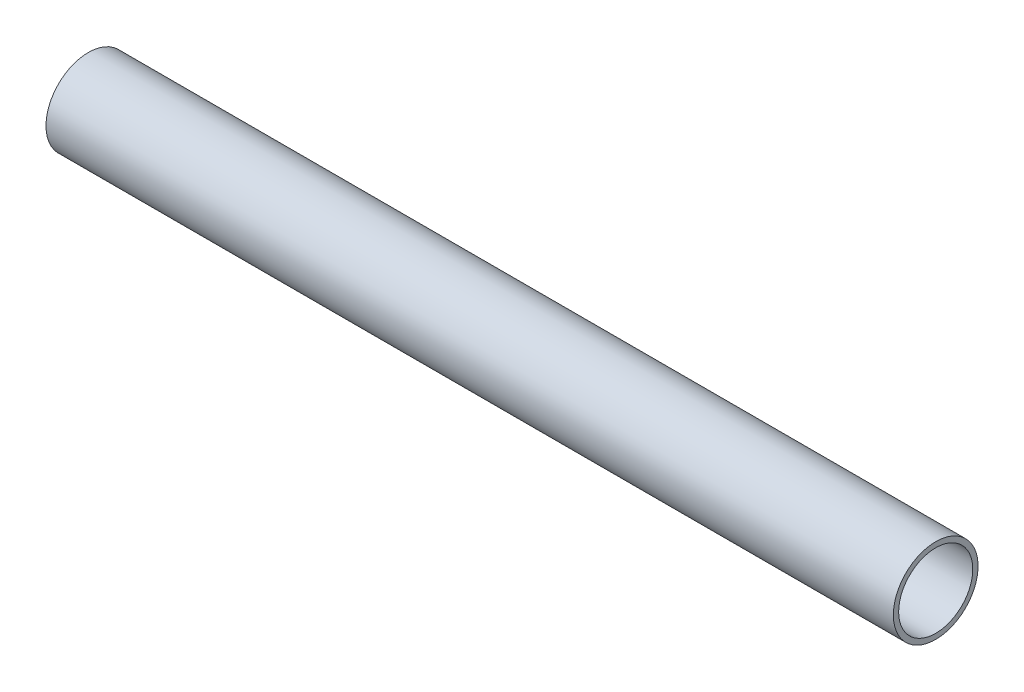
ISO-10303-21;
HEADER;
FILE_DESCRIPTION(('STEP AP214'),'2;1');
FILE_NAME('part.step','',(''),(''),'','','');
FILE_SCHEMA(('AUTOMOTIVE_DESIGN { 1 0 10303 214 1 1 1 1 }'));
ENDSEC;
DATA;
#1=APPLICATION_CONTEXT('core data for automotive mechanical design processes');
#2=APPLICATION_PROTOCOL_DEFINITION('international standard','automotive_design',2000,#1);
#3=PRODUCT_CONTEXT('',#1,'mechanical');
#4=PRODUCT('Part','Part','',(#3));
#5=PRODUCT_RELATED_PRODUCT_CATEGORY('part','',(#4));
#6=PRODUCT_DEFINITION_FORMATION('','',#4);
#7=PRODUCT_DEFINITION_CONTEXT('part definition',#1,'design');
#8=PRODUCT_DEFINITION('design','',#6,#7);
#9=PRODUCT_DEFINITION_SHAPE('','',#8);
#10=(LENGTH_UNIT() NAMED_UNIT(*) SI_UNIT(.MILLI.,.METRE.));
#11=(NAMED_UNIT(*) PLANE_ANGLE_UNIT() SI_UNIT($,.RADIAN.));
#12=(NAMED_UNIT(*) SI_UNIT($,.STERADIAN.) SOLID_ANGLE_UNIT());
#13=UNCERTAINTY_MEASURE_WITH_UNIT(LENGTH_MEASURE(1.E-05),#10,'distance_accuracy_value','');
#14=(GEOMETRIC_REPRESENTATION_CONTEXT(3) GLOBAL_UNCERTAINTY_ASSIGNED_CONTEXT((#13)) GLOBAL_UNIT_ASSIGNED_CONTEXT((#10,
#11,#12)) REPRESENTATION_CONTEXT('',''));
#15=CARTESIAN_POINT('',(0.,0.,0.));
#16=DIRECTION('',(0.,0.,1.));
#17=DIRECTION('',(1.,0.,0.));
#18=AXIS2_PLACEMENT_3D('',#15,#16,#17);
#19=CARTESIAN_POINT('',(0.,8.,0.));
#20=DIRECTION('',(1.,0.,0.));
#21=DIRECTION('',(0.,0.,-1.));
#22=AXIS2_PLACEMENT_3D('',#19,#20,#21);
#23=PLANE('',#22);
#24=CARTESIAN_POINT('',(0.,0.,0.));
#25=DIRECTION('',(-1.,0.,0.));
#26=DIRECTION('',(0.,0.,1.));
#27=AXIS2_PLACEMENT_3D('',#24,#25,#26);
#28=CIRCLE('',#27,7.00000000000002);
#29=CARTESIAN_POINT('',(0.,0.,7.00000000000002));
#30=VERTEX_POINT('',#29);
#31=EDGE_CURVE('E45',#30,#30,#28,.T.);
#32=ORIENTED_EDGE('',*,*,#31,.F.);
#33=EDGE_LOOP('',(#32));
#34=FACE_BOUND('',#33,.T.);
#35=CARTESIAN_POINT('',(0.,0.,0.));
#36=DIRECTION('',(-1.,0.,0.));
#37=DIRECTION('',(0.,0.,1.));
#38=AXIS2_PLACEMENT_3D('',#35,#36,#37);
#39=CIRCLE('',#38,8.);
#40=CARTESIAN_POINT('',(0.,0.,8.));
#41=VERTEX_POINT('',#40);
#42=EDGE_CURVE('E10',#41,#41,#39,.T.);
#43=ORIENTED_EDGE('',*,*,#42,.T.);
#44=EDGE_LOOP('',(#43));
#45=FACE_BOUND('',#44,.T.);
#46=ADVANCED_FACE('F31',(#34,#45),#23,.F.);
#47=CARTESIAN_POINT('',(0.,0.,0.));
#48=DIRECTION('',(-1.,0.,0.));
#49=DIRECTION('',(0.,0.,1.));
#50=AXIS2_PLACEMENT_3D('',#47,#48,#49);
#51=CYLINDRICAL_SURFACE('',#50,8.);
#52=CARTESIAN_POINT('',(160.,0.,0.));
#53=DIRECTION('',(-1.,0.,0.));
#54=DIRECTION('',(0.,0.,1.));
#55=AXIS2_PLACEMENT_3D('',#52,#53,#54);
#56=CIRCLE('',#55,8.);
#57=CARTESIAN_POINT('',(160.,0.,8.));
#58=VERTEX_POINT('',#57);
#59=EDGE_CURVE('E37',#58,#58,#56,.T.);
#60=ORIENTED_EDGE('',*,*,#59,.T.);
#61=EDGE_LOOP('',(#60));
#62=FACE_BOUND('',#61,.T.);
#63=ORIENTED_EDGE('',*,*,#42,.F.);
#64=EDGE_LOOP('',(#63));
#65=FACE_BOUND('',#64,.T.);
#66=ADVANCED_FACE('F55',(#62,#65),#51,.T.);
#67=CARTESIAN_POINT('',(160.,7.00000000000001,0.));
#68=DIRECTION('',(-1.,0.,0.));
#69=DIRECTION('',(0.,0.,1.));
#70=AXIS2_PLACEMENT_3D('',#67,#68,#69);
#71=PLANE('',#70);
#72=ORIENTED_EDGE('',*,*,#59,.F.);
#73=EDGE_LOOP('',(#72));
#74=FACE_BOUND('',#73,.T.);
#75=CARTESIAN_POINT('',(160.,0.,0.));
#76=DIRECTION('',(-1.,0.,0.));
#77=DIRECTION('',(0.,0.,1.));
#78=AXIS2_PLACEMENT_3D('',#75,#76,#77);
#79=CIRCLE('',#78,7.00000000000001);
#80=CARTESIAN_POINT('',(160.,0.,7.00000000000001));
#81=VERTEX_POINT('',#80);
#82=EDGE_CURVE('E41',#81,#81,#79,.T.);
#83=ORIENTED_EDGE('',*,*,#82,.T.);
#84=EDGE_LOOP('',(#83));
#85=FACE_BOUND('',#84,.T.);
#86=ADVANCED_FACE('F59',(#74,#85),#71,.F.);
#87=CARTESIAN_POINT('',(0.,0.,0.));
#88=DIRECTION('',(-1.,0.,0.));
#89=DIRECTION('',(0.,0.,1.));
#90=AXIS2_PLACEMENT_3D('',#87,#88,#89);
#91=CYLINDRICAL_SURFACE('',#90,7.00000000000002);
#92=ORIENTED_EDGE('',*,*,#31,.T.);
#93=EDGE_LOOP('',(#92));
#94=FACE_BOUND('',#93,.T.);
#95=ORIENTED_EDGE('',*,*,#82,.F.);
#96=EDGE_LOOP('',(#95));
#97=FACE_BOUND('',#96,.T.);
#98=ADVANCED_FACE('F51',(#94,#97),#91,.F.);
#99=CLOSED_SHELL('',(#46,#66,#86,#98));
#100=MANIFOLD_SOLID_BREP('B2',#99);
#101=ADVANCED_BREP_SHAPE_REPRESENTATION('',(#18,#100),#14);
#102=SHAPE_DEFINITION_REPRESENTATION(#9,#101);
ENDSEC;
END-ISO-10303-21;
